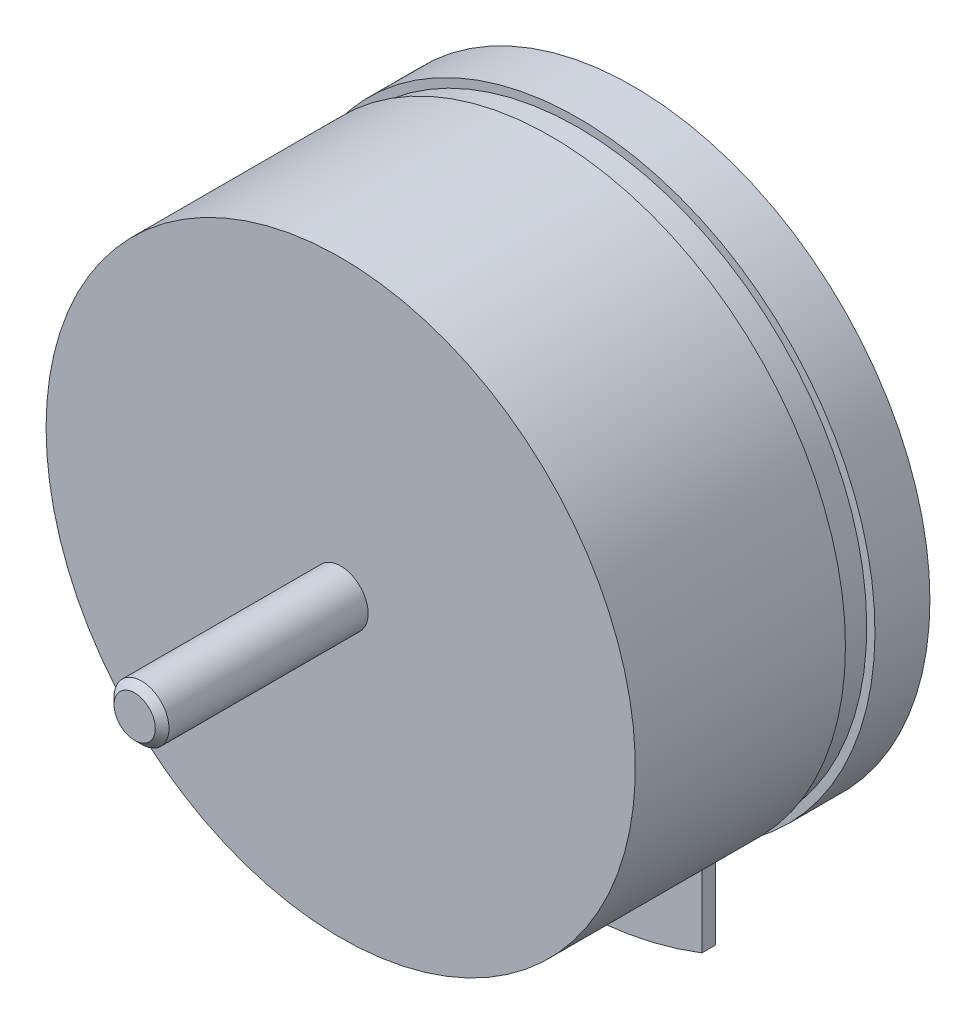
ISO-10303-21;
HEADER;
FILE_DESCRIPTION(('STEP AP214'),'2;1');
FILE_NAME('part.step','',(''),(''),'','','');
FILE_SCHEMA(('AUTOMOTIVE_DESIGN { 1 0 10303 214 1 1 1 1 }'));
ENDSEC;
DATA;
#1=APPLICATION_CONTEXT('core data for automotive mechanical design processes');
#2=APPLICATION_PROTOCOL_DEFINITION('international standard','automotive_design',2000,#1);
#3=PRODUCT_CONTEXT('',#1,'mechanical');
#4=PRODUCT('Part','Part','',(#3));
#5=PRODUCT_RELATED_PRODUCT_CATEGORY('part','',(#4));
#6=PRODUCT_DEFINITION_FORMATION('','',#4);
#7=PRODUCT_DEFINITION_CONTEXT('part definition',#1,'design');
#8=PRODUCT_DEFINITION('design','',#6,#7);
#9=PRODUCT_DEFINITION_SHAPE('','',#8);
#10=(LENGTH_UNIT() NAMED_UNIT(*) SI_UNIT(.MILLI.,.METRE.));
#11=(NAMED_UNIT(*) PLANE_ANGLE_UNIT() SI_UNIT($,.RADIAN.));
#12=(NAMED_UNIT(*) SI_UNIT($,.STERADIAN.) SOLID_ANGLE_UNIT());
#13=UNCERTAINTY_MEASURE_WITH_UNIT(LENGTH_MEASURE(1.E-05),#10,'distance_accuracy_value','');
#14=(GEOMETRIC_REPRESENTATION_CONTEXT(3) GLOBAL_UNCERTAINTY_ASSIGNED_CONTEXT((#13)) GLOBAL_UNIT_ASSIGNED_CONTEXT((#10,
#11,#12)) REPRESENTATION_CONTEXT('',''));
#15=CARTESIAN_POINT('',(0.,0.,0.));
#16=DIRECTION('',(0.,0.,1.));
#17=DIRECTION('',(1.,0.,0.));
#18=AXIS2_PLACEMENT_3D('',#15,#16,#17);
#19=CARTESIAN_POINT('',(0.,0.,4.));
#20=DIRECTION('',(0.,0.,1.));
#21=DIRECTION('',(1.,0.,0.));
#22=AXIS2_PLACEMENT_3D('',#19,#20,#21);
#23=PLANE('',#22);
#24=CARTESIAN_POINT('',(0.,0.,4.));
#25=DIRECTION('',(0.,0.,1.));
#26=DIRECTION('',(1.,0.,0.));
#27=AXIS2_PLACEMENT_3D('',#24,#25,#26);
#28=CIRCLE('',#27,21.6);
#29=CARTESIAN_POINT('',(10.,-19.1457567100389,4.));
#30=VERTEX_POINT('',#29);
#31=CARTESIAN_POINT('',(-10.,-19.1457567100389,4.));
#32=VERTEX_POINT('',#31);
#33=EDGE_CURVE('E151',#30,#32,#28,.T.);
#34=ORIENTED_EDGE('',*,*,#33,.T.);
#35=DIRECTION('',(0.,-1.,0.));
#36=VECTOR('',#35,1.);
#37=CARTESIAN_POINT('',(-10.,-18.4661853126194,4.));
#38=LINE('',#37,#36);
#39=CARTESIAN_POINT('',(-10.,-18.4661853126194,4.));
#40=VERTEX_POINT('',#39);
#41=EDGE_CURVE('E293',#40,#32,#38,.T.);
#42=ORIENTED_EDGE('',*,*,#41,.F.);
#43=CARTESIAN_POINT('',(0.,0.,4.));
#44=DIRECTION('',(0.,0.,1.));
#45=DIRECTION('',(1.,0.,0.));
#46=AXIS2_PLACEMENT_3D('',#43,#44,#45);
#47=CIRCLE('',#46,21.);
#48=CARTESIAN_POINT('',(10.,-18.4661853126194,4.));
#49=VERTEX_POINT('',#48);
#50=EDGE_CURVE('E108',#49,#40,#47,.T.);
#51=ORIENTED_EDGE('',*,*,#50,.F.);
#52=DIRECTION('',(0.,1.,0.));
#53=VECTOR('',#52,1.);
#54=CARTESIAN_POINT('',(10.,-18.4661853126194,4.));
#55=LINE('',#54,#53);
#56=EDGE_CURVE('E290',#30,#49,#55,.T.);
#57=ORIENTED_EDGE('',*,*,#56,.F.);
#58=EDGE_LOOP('',(#34,#42,#51,#57));
#59=FACE_BOUND('',#58,.T.);
#60=ADVANCED_FACE('F36',(#59),#23,.T.);
#61=CARTESIAN_POINT('',(0.,0.,6.));
#62=DIRECTION('',(0.,0.,-1.));
#63=DIRECTION('',(-1.,0.,0.));
#64=AXIS2_PLACEMENT_3D('',#61,#62,#63);
#65=CYLINDRICAL_SURFACE('',#64,21.);
#66=CARTESIAN_POINT('',(0.,0.,6.));
#67=DIRECTION('',(0.,0.,1.));
#68=DIRECTION('',(1.,0.,0.));
#69=AXIS2_PLACEMENT_3D('',#66,#67,#68);
#70=CIRCLE('',#69,21.);
#71=CARTESIAN_POINT('',(21.,0.,6.));
#72=VERTEX_POINT('',#71);
#73=EDGE_CURVE('E111',#72,#72,#70,.T.);
#74=ORIENTED_EDGE('',*,*,#73,.F.);
#75=EDGE_LOOP('',(#74));
#76=FACE_BOUND('',#75,.T.);
#77=DIRECTION('',(0.,0.,-1.));
#78=VECTOR('',#77,1.);
#79=CARTESIAN_POINT('',(-10.,-18.4661853126194,5.));
#80=LINE('',#79,#78);
#81=CARTESIAN_POINT('',(-10.,-18.4661853126194,5.));
#82=VERTEX_POINT('',#81);
#83=EDGE_CURVE('E283',#82,#40,#80,.T.);
#84=ORIENTED_EDGE('',*,*,#83,.F.);
#85=CARTESIAN_POINT('',(0.,0.,5.));
#86=DIRECTION('',(0.,0.,1.));
#87=DIRECTION('',(1.,0.,0.));
#88=AXIS2_PLACEMENT_3D('',#85,#86,#87);
#89=CIRCLE('',#88,21.);
#90=CARTESIAN_POINT('',(10.,-18.4661853126194,5.));
#91=VERTEX_POINT('',#90);
#92=EDGE_CURVE('E99',#82,#91,#89,.T.);
#93=ORIENTED_EDGE('',*,*,#92,.T.);
#94=DIRECTION('',(0.,0.,-1.));
#95=VECTOR('',#94,1.);
#96=CARTESIAN_POINT('',(10.,-18.4661853126194,5.));
#97=LINE('',#96,#95);
#98=EDGE_CURVE('E51',#91,#49,#97,.T.);
#99=ORIENTED_EDGE('',*,*,#98,.T.);
#100=ORIENTED_EDGE('',*,*,#50,.T.);
#101=EDGE_LOOP('',(#84,#93,#99,#100));
#102=FACE_BOUND('',#101,.T.);
#103=ADVANCED_FACE('F180',(#76,#102),#65,.T.);
#104=CARTESIAN_POINT('',(0.,0.,-3.2));
#105=DIRECTION('',(0.,0.,-1.));
#106=DIRECTION('',(-1.,0.,0.));
#107=AXIS2_PLACEMENT_3D('',#104,#105,#106);
#108=PLANE('',#107);
#109=CARTESIAN_POINT('',(0.,0.,-3.2));
#110=DIRECTION('',(0.,0.,-1.));
#111=DIRECTION('',(-1.,0.,0.));
#112=AXIS2_PLACEMENT_3D('',#109,#110,#111);
#113=CIRCLE('',#112,6.);
#114=CARTESIAN_POINT('',(-6.,0.,-3.2));
#115=VERTEX_POINT('',#114);
#116=EDGE_CURVE('E124',#115,#115,#113,.T.);
#117=ORIENTED_EDGE('',*,*,#116,.T.);
#118=EDGE_LOOP('',(#117));
#119=FACE_BOUND('',#118,.T.);
#120=CARTESIAN_POINT('',(0.,0.,-3.2));
#121=DIRECTION('',(0.,0.,-1.));
#122=DIRECTION('',(-1.,0.,0.));
#123=AXIS2_PLACEMENT_3D('',#120,#121,#122);
#124=CIRCLE('',#123,2.);
#125=CARTESIAN_POINT('',(-2.,0.,-3.2));
#126=VERTEX_POINT('',#125);
#127=EDGE_CURVE('E121',#126,#126,#124,.T.);
#128=ORIENTED_EDGE('',*,*,#127,.F.);
#129=EDGE_LOOP('',(#128));
#130=FACE_BOUND('',#129,.T.);
#131=ADVANCED_FACE('F186',(#119,#130),#108,.T.);
#132=CARTESIAN_POINT('',(0.,0.,0.));
#133=DIRECTION('',(0.,0.,1.));
#134=DIRECTION('',(1.,0.,0.));
#135=AXIS2_PLACEMENT_3D('',#132,#133,#134);
#136=PLANE('',#135);
#137=CARTESIAN_POINT('',(0.,0.,0.));
#138=DIRECTION('',(0.,0.,1.));
#139=DIRECTION('',(1.,0.,0.));
#140=AXIS2_PLACEMENT_3D('',#137,#138,#139);
#141=CIRCLE('',#140,21.6);
#142=CARTESIAN_POINT('',(21.6,0.,0.));
#143=VERTEX_POINT('',#142);
#144=EDGE_CURVE('E148',#143,#143,#141,.T.);
#145=ORIENTED_EDGE('',*,*,#144,.F.);
#146=EDGE_LOOP('',(#145));
#147=FACE_BOUND('',#146,.T.);
#148=CARTESIAN_POINT('',(0.,11.,0.));
#149=DIRECTION('',(0.,0.,-1.));
#150=DIRECTION('',(-1.,0.,0.));
#151=AXIS2_PLACEMENT_3D('',#148,#149,#150);
#152=CIRCLE('',#151,1.25);
#153=CARTESIAN_POINT('',(-1.25,11.,0.));
#154=VERTEX_POINT('',#153);
#155=EDGE_CURVE('E137',#154,#154,#152,.T.);
#156=ORIENTED_EDGE('',*,*,#155,.F.);
#157=EDGE_LOOP('',(#156));
#158=FACE_BOUND('',#157,.T.);
#159=CARTESIAN_POINT('',(9.5262794416288,-5.50000000000004,0.));
#160=DIRECTION('',(0.,0.,-1.));
#161=DIRECTION('',(0.500000000000004,0.866025403784436,0.));
#162=AXIS2_PLACEMENT_3D('',#159,#160,#161);
#163=CIRCLE('',#162,1.25);
#164=CARTESIAN_POINT('',(10.1512794416288,-4.4174682452695,0.));
#165=VERTEX_POINT('',#164);
#166=EDGE_CURVE('E131',#165,#165,#163,.T.);
#167=ORIENTED_EDGE('',*,*,#166,.F.);
#168=EDGE_LOOP('',(#167));
#169=FACE_BOUND('',#168,.T.);
#170=CARTESIAN_POINT('',(-9.52627944162887,-5.49999999999991,0.));
#171=DIRECTION('',(0.,0.,-1.));
#172=DIRECTION('',(0.499999999999992,-0.866025403784443,0.));
#173=AXIS2_PLACEMENT_3D('',#170,#171,#172);
#174=CIRCLE('',#173,1.25);
#175=CARTESIAN_POINT('',(-8.90127944162888,-6.58253175473047,0.));
#176=VERTEX_POINT('',#175);
#177=EDGE_CURVE('E127',#176,#176,#174,.T.);
#178=ORIENTED_EDGE('',*,*,#177,.F.);
#179=EDGE_LOOP('',(#178));
#180=FACE_BOUND('',#179,.T.);
#181=CARTESIAN_POINT('',(0.,0.,0.));
#182=DIRECTION('',(0.,0.,1.));
#183=DIRECTION('',(1.,0.,0.));
#184=AXIS2_PLACEMENT_3D('',#181,#182,#183);
#185=CIRCLE('',#184,6.);
#186=CARTESIAN_POINT('',(6.,0.,0.));
#187=VERTEX_POINT('',#186);
#188=EDGE_CURVE('E156',#187,#187,#185,.F.);
#189=ORIENTED_EDGE('',*,*,#188,.F.);
#190=EDGE_LOOP('',(#189));
#191=FACE_BOUND('',#190,.T.);
#192=ADVANCED_FACE('F194',(#147,#158,#169,#180,#191),#136,.F.);
#193=CARTESIAN_POINT('',(0.,0.,4.));
#194=DIRECTION('',(0.,0.,-1.));
#195=DIRECTION('',(-1.,0.,0.));
#196=AXIS2_PLACEMENT_3D('',#193,#194,#195);
#197=CYLINDRICAL_SURFACE('',#196,21.6);
#198=EDGE_CURVE('E59',#32,#30,#28,.T.);
#199=ORIENTED_EDGE('',*,*,#198,.F.);
#200=ORIENTED_EDGE('',*,*,#33,.F.);
#201=EDGE_LOOP('',(#199,#200));
#202=FACE_BOUND('',#201,.T.);
#203=ORIENTED_EDGE('',*,*,#144,.T.);
#204=EDGE_LOOP('',(#203));
#205=FACE_BOUND('',#204,.T.);
#206=ADVANCED_FACE('F197',(#202,#205),#197,.T.);
#207=CARTESIAN_POINT('',(0.,11.,3.9));
#208=DIRECTION('',(0.,0.,-1.));
#209=DIRECTION('',(-1.,0.,0.));
#210=AXIS2_PLACEMENT_3D('',#207,#208,#209);
#211=CYLINDRICAL_SURFACE('',#210,1.25);
#212=CARTESIAN_POINT('',(0.,11.,3.9));
#213=DIRECTION('',(0.,0.,-1.));
#214=DIRECTION('',(-1.,0.,0.));
#215=AXIS2_PLACEMENT_3D('',#212,#213,#214);
#216=CIRCLE('',#215,1.25);
#217=CARTESIAN_POINT('',(-1.25,11.,3.9));
#218=VERTEX_POINT('',#217);
#219=EDGE_CURVE('E140',#218,#218,#216,.T.);
#220=ORIENTED_EDGE('',*,*,#219,.F.);
#221=EDGE_LOOP('',(#220));
#222=FACE_BOUND('',#221,.T.);
#223=ORIENTED_EDGE('',*,*,#155,.T.);
#224=EDGE_LOOP('',(#223));
#225=FACE_BOUND('',#224,.T.);
#226=ADVANCED_FACE('F200',(#222,#225),#211,.F.);
#227=CARTESIAN_POINT('',(0.,11.,3.9));
#228=DIRECTION('',(0.,0.,-1.));
#229=DIRECTION('',(-1.,0.,0.));
#230=AXIS2_PLACEMENT_3D('',#227,#228,#229);
#231=PLANE('',#230);
#232=ORIENTED_EDGE('',*,*,#219,.T.);
#233=EDGE_LOOP('',(#232));
#234=FACE_BOUND('',#233,.T.);
#235=ADVANCED_FACE('F205',(#234),#231,.T.);
#236=CARTESIAN_POINT('',(9.5262794416288,-5.50000000000004,3.9));
#237=DIRECTION('',(0.,0.,-1.));
#238=DIRECTION('',(-1.,0.,0.));
#239=AXIS2_PLACEMENT_3D('',#236,#237,#238);
#240=CYLINDRICAL_SURFACE('',#239,1.25);
#241=CARTESIAN_POINT('',(9.5262794416288,-5.50000000000004,3.9));
#242=DIRECTION('',(0.,0.,-1.));
#243=DIRECTION('',(0.500000000000004,0.866025403784436,0.));
#244=AXIS2_PLACEMENT_3D('',#241,#242,#243);
#245=CIRCLE('',#244,1.25);
#246=CARTESIAN_POINT('',(10.1512794416288,-4.4174682452695,3.9));
#247=VERTEX_POINT('',#246);
#248=EDGE_CURVE('E134',#247,#247,#245,.T.);
#249=ORIENTED_EDGE('',*,*,#248,.F.);
#250=EDGE_LOOP('',(#249));
#251=FACE_BOUND('',#250,.T.);
#252=ORIENTED_EDGE('',*,*,#166,.T.);
#253=EDGE_LOOP('',(#252));
#254=FACE_BOUND('',#253,.T.);
#255=ADVANCED_FACE('F245',(#251,#254),#240,.F.);
#256=CARTESIAN_POINT('',(9.5262794416288,-5.50000000000004,3.9));
#257=DIRECTION('',(0.,0.,-1.));
#258=DIRECTION('',(0.500000000000004,0.866025403784436,0.));
#259=AXIS2_PLACEMENT_3D('',#256,#257,#258);
#260=PLANE('',#259);
#261=ORIENTED_EDGE('',*,*,#248,.T.);
#262=EDGE_LOOP('',(#261));
#263=FACE_BOUND('',#262,.T.);
#264=ADVANCED_FACE('F241',(#263),#260,.T.);
#265=CARTESIAN_POINT('',(-9.52627944162887,-5.49999999999991,3.9));
#266=DIRECTION('',(0.,0.,-1.));
#267=DIRECTION('',(-1.,0.,0.));
#268=AXIS2_PLACEMENT_3D('',#265,#266,#267);
#269=CYLINDRICAL_SURFACE('',#268,1.25);
#270=CARTESIAN_POINT('',(-9.52627944162887,-5.49999999999991,3.9));
#271=DIRECTION('',(0.,0.,-1.));
#272=DIRECTION('',(0.499999999999992,-0.866025403784443,0.));
#273=AXIS2_PLACEMENT_3D('',#270,#271,#272);
#274=CIRCLE('',#273,1.25);
#275=CARTESIAN_POINT('',(-8.90127944162888,-6.58253175473047,3.9));
#276=VERTEX_POINT('',#275);
#277=EDGE_CURVE('E128',#276,#276,#274,.T.);
#278=ORIENTED_EDGE('',*,*,#277,.F.);
#279=EDGE_LOOP('',(#278));
#280=FACE_BOUND('',#279,.T.);
#281=ORIENTED_EDGE('',*,*,#177,.T.);
#282=EDGE_LOOP('',(#281));
#283=FACE_BOUND('',#282,.T.);
#284=ADVANCED_FACE('F233',(#280,#283),#269,.F.);
#285=CARTESIAN_POINT('',(-9.52627944162887,-5.49999999999991,3.9));
#286=DIRECTION('',(0.,0.,-1.));
#287=DIRECTION('',(0.499999999999992,-0.866025403784443,0.));
#288=AXIS2_PLACEMENT_3D('',#285,#286,#287);
#289=PLANE('',#288);
#290=ORIENTED_EDGE('',*,*,#277,.T.);
#291=EDGE_LOOP('',(#290));
#292=FACE_BOUND('',#291,.T.);
#293=ADVANCED_FACE('F223',(#292),#289,.T.);
#294=CARTESIAN_POINT('',(0.,0.,-3.2));
#295=DIRECTION('',(0.,0.,1.));
#296=DIRECTION('',(1.,0.,0.));
#297=AXIS2_PLACEMENT_3D('',#294,#295,#296);
#298=CYLINDRICAL_SURFACE('',#297,6.);
#299=ORIENTED_EDGE('',*,*,#116,.F.);
#300=EDGE_LOOP('',(#299));
#301=FACE_BOUND('',#300,.T.);
#302=ORIENTED_EDGE('',*,*,#188,.T.);
#303=EDGE_LOOP('',(#302));
#304=FACE_BOUND('',#303,.T.);
#305=ADVANCED_FACE('F220',(#301,#304),#298,.T.);
#306=CARTESIAN_POINT('',(0.,0.,-11.));
#307=DIRECTION('',(0.,0.,1.));
#308=DIRECTION('',(1.,0.,0.));
#309=AXIS2_PLACEMENT_3D('',#306,#307,#308);
#310=CYLINDRICAL_SURFACE('',#309,2.);
#311=CARTESIAN_POINT('',(0.,0.,-10.5));
#312=DIRECTION('',(0.,0.,-1.));
#313=DIRECTION('',(-1.,0.,0.));
#314=AXIS2_PLACEMENT_3D('',#311,#312,#313);
#315=CIRCLE('',#314,2.);
#316=CARTESIAN_POINT('',(-2.,0.,-10.5));
#317=VERTEX_POINT('',#316);
#318=EDGE_CURVE('E163',#317,#317,#315,.F.);
#319=ORIENTED_EDGE('',*,*,#318,.T.);
#320=EDGE_LOOP('',(#319));
#321=FACE_BOUND('',#320,.T.);
#322=ORIENTED_EDGE('',*,*,#127,.T.);
#323=EDGE_LOOP('',(#322));
#324=FACE_BOUND('',#323,.T.);
#325=ADVANCED_FACE('F222',(#321,#324),#310,.T.);
#326=CARTESIAN_POINT('',(0.,0.,-11.));
#327=DIRECTION('',(0.,0.,-1.));
#328=DIRECTION('',(-1.,0.,0.));
#329=AXIS2_PLACEMENT_3D('',#326,#327,#328);
#330=PLANE('',#329);
#331=CARTESIAN_POINT('',(0.,0.,-11.));
#332=DIRECTION('',(0.,0.,-1.));
#333=DIRECTION('',(-1.,0.,0.));
#334=AXIS2_PLACEMENT_3D('',#331,#332,#333);
#335=CIRCLE('',#334,1.5);
#336=CARTESIAN_POINT('',(-1.5,0.,-11.));
#337=VERTEX_POINT('',#336);
#338=EDGE_CURVE('E160',#337,#337,#335,.T.);
#339=ORIENTED_EDGE('',*,*,#338,.T.);
#340=EDGE_LOOP('',(#339));
#341=FACE_BOUND('',#340,.T.);
#342=ADVANCED_FACE('F230',(#341),#330,.T.);
#343=CARTESIAN_POINT('',(0.,0.,6.));
#344=DIRECTION('',(0.,0.,1.));
#345=DIRECTION('',(1.,0.,0.));
#346=AXIS2_PLACEMENT_3D('',#343,#344,#345);
#347=PLANE('',#346);
#348=CARTESIAN_POINT('',(0.,0.,6.));
#349=DIRECTION('',(0.,0.,1.));
#350=DIRECTION('',(1.,0.,0.));
#351=AXIS2_PLACEMENT_3D('',#348,#349,#350);
#352=CIRCLE('',#351,21.45);
#353=CARTESIAN_POINT('',(21.45,0.,6.));
#354=VERTEX_POINT('',#353);
#355=EDGE_CURVE('E117',#354,#354,#352,.T.);
#356=ORIENTED_EDGE('',*,*,#355,.F.);
#357=EDGE_LOOP('',(#356));
#358=FACE_BOUND('',#357,.T.);
#359=ORIENTED_EDGE('',*,*,#73,.T.);
#360=EDGE_LOOP('',(#359));
#361=FACE_BOUND('',#360,.T.);
#362=ADVANCED_FACE('F256',(#358,#361),#347,.F.);
#363=CARTESIAN_POINT('',(0.,0.,36.3));
#364=DIRECTION('',(0.,0.,1.));
#365=DIRECTION('',(1.,0.,0.));
#366=AXIS2_PLACEMENT_3D('',#363,#364,#365);
#367=PLANE('',#366);
#368=CARTESIAN_POINT('',(0.,0.,36.3));
#369=DIRECTION('',(0.,0.,1.));
#370=DIRECTION('',(1.,0.,0.));
#371=AXIS2_PLACEMENT_3D('',#368,#369,#370);
#372=CIRCLE('',#371,1.5);
#373=CARTESIAN_POINT('',(1.5,0.,36.3));
#374=VERTEX_POINT('',#373);
#375=EDGE_CURVE('E44',#374,#374,#372,.T.);
#376=ORIENTED_EDGE('',*,*,#375,.T.);
#377=EDGE_LOOP('',(#376));
#378=FACE_BOUND('',#377,.T.);
#379=ADVANCED_FACE('F168',(#378),#367,.T.);
#380=CARTESIAN_POINT('',(0.,0.,36.3));
#381=DIRECTION('',(0.,0.,-1.));
#382=DIRECTION('',(-1.,0.,0.));
#383=AXIS2_PLACEMENT_3D('',#380,#381,#382);
#384=CYLINDRICAL_SURFACE('',#383,2.);
#385=CARTESIAN_POINT('',(0.,0.,35.8));
#386=DIRECTION('',(0.,0.,1.));
#387=DIRECTION('',(1.,0.,0.));
#388=AXIS2_PLACEMENT_3D('',#385,#386,#387);
#389=CIRCLE('',#388,2.);
#390=CARTESIAN_POINT('',(2.,0.,35.8));
#391=VERTEX_POINT('',#390);
#392=EDGE_CURVE('E11',#391,#391,#389,.F.);
#393=ORIENTED_EDGE('',*,*,#392,.T.);
#394=EDGE_LOOP('',(#393));
#395=FACE_BOUND('',#394,.T.);
#396=CARTESIAN_POINT('',(0.,0.,21.3));
#397=DIRECTION('',(0.,0.,-1.));
#398=DIRECTION('',(-1.,0.,0.));
#399=AXIS2_PLACEMENT_3D('',#396,#397,#398);
#400=CIRCLE('',#399,2.);
#401=CARTESIAN_POINT('',(-2.,0.,21.3));
#402=VERTEX_POINT('',#401);
#403=EDGE_CURVE('E150',#402,#402,#400,.F.);
#404=ORIENTED_EDGE('',*,*,#403,.T.);
#405=EDGE_LOOP('',(#404));
#406=FACE_BOUND('',#405,.T.);
#407=ADVANCED_FACE('F255',(#395,#406),#384,.T.);
#408=CARTESIAN_POINT('',(0.,0.,21.3));
#409=DIRECTION('',(0.,0.,-1.));
#410=DIRECTION('',(-1.,0.,0.));
#411=AXIS2_PLACEMENT_3D('',#408,#409,#410);
#412=PLANE('',#411);
#413=CARTESIAN_POINT('',(0.,0.,21.3));
#414=DIRECTION('',(0.,0.,-1.));
#415=DIRECTION('',(-1.,0.,0.));
#416=AXIS2_PLACEMENT_3D('',#413,#414,#415);
#417=CIRCLE('',#416,21.45);
#418=CARTESIAN_POINT('',(-21.45,0.,21.3));
#419=VERTEX_POINT('',#418);
#420=EDGE_CURVE('E143',#419,#419,#417,.T.);
#421=ORIENTED_EDGE('',*,*,#420,.F.);
#422=EDGE_LOOP('',(#421));
#423=FACE_BOUND('',#422,.T.);
#424=ORIENTED_EDGE('',*,*,#403,.F.);
#425=EDGE_LOOP('',(#424));
#426=FACE_BOUND('',#425,.T.);
#427=ADVANCED_FACE('F258',(#423,#426),#412,.F.);
#428=CARTESIAN_POINT('',(0.,0.,21.3));
#429=DIRECTION('',(0.,0.,-1.));
#430=DIRECTION('',(-1.,0.,0.));
#431=AXIS2_PLACEMENT_3D('',#428,#429,#430);
#432=CYLINDRICAL_SURFACE('',#431,21.45);
#433=ORIENTED_EDGE('',*,*,#355,.T.);
#434=EDGE_LOOP('',(#433));
#435=FACE_BOUND('',#434,.T.);
#436=ORIENTED_EDGE('',*,*,#420,.T.);
#437=EDGE_LOOP('',(#436));
#438=FACE_BOUND('',#437,.T.);
#439=ADVANCED_FACE('F192',(#435,#438),#432,.T.);
#440=CARTESIAN_POINT('',(0.,0.,5.));
#441=DIRECTION('',(0.,0.,1.));
#442=DIRECTION('',(1.,0.,0.));
#443=AXIS2_PLACEMENT_3D('',#440,#441,#442);
#444=PLANE('',#443);
#445=ORIENTED_EDGE('',*,*,#92,.F.);
#446=DIRECTION('',(0.,-1.,0.));
#447=VECTOR('',#446,1.);
#448=CARTESIAN_POINT('',(-10.,-18.4661853126194,5.));
#449=LINE('',#448,#447);
#450=CARTESIAN_POINT('',(-10.,-25.5453408124109,5.));
#451=VERTEX_POINT('',#450);
#452=EDGE_CURVE('E94',#82,#451,#449,.T.);
#453=ORIENTED_EDGE('',*,*,#452,.T.);
#454=CARTESIAN_POINT('',(0.,0.,5.));
#455=DIRECTION('',(0.,0.,1.));
#456=DIRECTION('',(1.,0.,0.));
#457=AXIS2_PLACEMENT_3D('',#454,#455,#456);
#458=CIRCLE('',#457,27.4329079250127);
#459=CARTESIAN_POINT('',(10.,-25.5453408124109,5.));
#460=VERTEX_POINT('',#459);
#461=EDGE_CURVE('E85',#451,#460,#458,.T.);
#462=ORIENTED_EDGE('',*,*,#461,.T.);
#463=DIRECTION('',(0.,1.,0.));
#464=VECTOR('',#463,1.);
#465=CARTESIAN_POINT('',(10.,-18.4661853126194,5.));
#466=LINE('',#465,#464);
#467=EDGE_CURVE('E93',#460,#91,#466,.T.);
#468=ORIENTED_EDGE('',*,*,#467,.T.);
#469=EDGE_LOOP('',(#445,#453,#462,#468));
#470=FACE_BOUND('',#469,.T.);
#471=ADVANCED_FACE('F97',(#470),#444,.T.);
#472=CARTESIAN_POINT('',(0.,0.,4.));
#473=DIRECTION('',(0.,0.,1.));
#474=DIRECTION('',(1.,0.,0.));
#475=AXIS2_PLACEMENT_3D('',#472,#473,#474);
#476=PLANE('',#475);
#477=CARTESIAN_POINT('',(-10.,-25.5453408124109,4.));
#478=VERTEX_POINT('',#477);
#479=EDGE_CURVE('E106',#32,#478,#38,.T.);
#480=ORIENTED_EDGE('',*,*,#479,.F.);
#481=ORIENTED_EDGE('',*,*,#198,.T.);
#482=CARTESIAN_POINT('',(10.,-25.5453408124109,4.));
#483=VERTEX_POINT('',#482);
#484=EDGE_CURVE('E102',#483,#30,#55,.T.);
#485=ORIENTED_EDGE('',*,*,#484,.F.);
#486=CARTESIAN_POINT('',(0.,0.,4.));
#487=DIRECTION('',(0.,0.,1.));
#488=DIRECTION('',(1.,0.,0.));
#489=AXIS2_PLACEMENT_3D('',#486,#487,#488);
#490=CIRCLE('',#489,27.4329079250127);
#491=EDGE_CURVE('E291',#478,#483,#490,.T.);
#492=ORIENTED_EDGE('',*,*,#491,.F.);
#493=EDGE_LOOP('',(#480,#481,#485,#492));
#494=FACE_BOUND('',#493,.T.);
#495=ADVANCED_FACE('F274',(#494),#476,.F.);
#496=CARTESIAN_POINT('',(-10.,-18.4661853126194,5.));
#497=DIRECTION('',(1.,0.,0.));
#498=DIRECTION('',(0.,0.,-1.));
#499=AXIS2_PLACEMENT_3D('',#496,#497,#498);
#500=PLANE('',#499);
#501=ORIENTED_EDGE('',*,*,#41,.T.);
#502=ORIENTED_EDGE('',*,*,#479,.T.);
#503=DIRECTION('',(0.,0.,-1.));
#504=VECTOR('',#503,1.);
#505=CARTESIAN_POINT('',(-10.,-25.5453408124109,5.));
#506=LINE('',#505,#504);
#507=EDGE_CURVE('E89',#451,#478,#506,.T.);
#508=ORIENTED_EDGE('',*,*,#507,.F.);
#509=ORIENTED_EDGE('',*,*,#452,.F.);
#510=ORIENTED_EDGE('',*,*,#83,.T.);
#511=EDGE_LOOP('',(#501,#502,#508,#509,#510));
#512=FACE_BOUND('',#511,.T.);
#513=ADVANCED_FACE('F105',(#512),#500,.F.);
#514=CARTESIAN_POINT('',(0.,0.,5.));
#515=DIRECTION('',(0.,0.,-1.));
#516=DIRECTION('',(-1.,0.,0.));
#517=AXIS2_PLACEMENT_3D('',#514,#515,#516);
#518=CYLINDRICAL_SURFACE('',#517,27.4329079250127);
#519=ORIENTED_EDGE('',*,*,#491,.T.);
#520=DIRECTION('',(0.,0.,-1.));
#521=VECTOR('',#520,1.);
#522=CARTESIAN_POINT('',(10.,-25.5453408124109,5.));
#523=LINE('',#522,#521);
#524=EDGE_CURVE('E91',#460,#483,#523,.T.);
#525=ORIENTED_EDGE('',*,*,#524,.F.);
#526=ORIENTED_EDGE('',*,*,#461,.F.);
#527=ORIENTED_EDGE('',*,*,#507,.T.);
#528=EDGE_LOOP('',(#519,#525,#526,#527));
#529=FACE_BOUND('',#528,.T.);
#530=ADVANCED_FACE('F87',(#529),#518,.T.);
#531=CARTESIAN_POINT('',(10.,-18.4661853126194,5.));
#532=DIRECTION('',(-1.,0.,0.));
#533=DIRECTION('',(0.,-1.,0.));
#534=AXIS2_PLACEMENT_3D('',#531,#532,#533);
#535=PLANE('',#534);
#536=ORIENTED_EDGE('',*,*,#484,.T.);
#537=ORIENTED_EDGE('',*,*,#56,.T.);
#538=ORIENTED_EDGE('',*,*,#98,.F.);
#539=ORIENTED_EDGE('',*,*,#467,.F.);
#540=ORIENTED_EDGE('',*,*,#524,.T.);
#541=EDGE_LOOP('',(#536,#537,#538,#539,#540));
#542=FACE_BOUND('',#541,.T.);
#543=ADVANCED_FACE('F176',(#542),#535,.F.);
#544=CARTESIAN_POINT('',(0.,0.,-11.));
#545=DIRECTION('',(0.,0.,1.));
#546=DIRECTION('',(1.,0.,0.));
#547=AXIS2_PLACEMENT_3D('',#544,#545,#546);
#548=CONICAL_SURFACE('',#547,1.5,0.785398163397448);
#549=ORIENTED_EDGE('',*,*,#318,.F.);
#550=EDGE_LOOP('',(#549));
#551=FACE_BOUND('',#550,.T.);
#552=ORIENTED_EDGE('',*,*,#338,.F.);
#553=EDGE_LOOP('',(#552));
#554=FACE_BOUND('',#553,.T.);
#555=ADVANCED_FACE('F171',(#551,#554),#548,.T.);
#556=CARTESIAN_POINT('',(0.,0.,36.3));
#557=DIRECTION('',(0.,0.,-1.));
#558=DIRECTION('',(-1.,0.,0.));
#559=AXIS2_PLACEMENT_3D('',#556,#557,#558);
#560=CONICAL_SURFACE('',#559,1.5,0.785398163397447);
#561=ORIENTED_EDGE('',*,*,#392,.F.);
#562=EDGE_LOOP('',(#561));
#563=FACE_BOUND('',#562,.T.);
#564=ORIENTED_EDGE('',*,*,#375,.F.);
#565=EDGE_LOOP('',(#564));
#566=FACE_BOUND('',#565,.T.);
#567=ADVANCED_FACE('F38',(#563,#566),#560,.T.);
#568=CLOSED_SHELL('',(#60,#103,#131,#192,#206,#226,#235,#255,#264,#284,#293,#305,#325,#342,#362,
#379,#407,#427,#439,#471,#495,#513,#530,#543,#555,#567));
#569=MANIFOLD_SOLID_BREP('B2',#568);
#570=ADVANCED_BREP_SHAPE_REPRESENTATION('',(#18,#569),#14);
#571=SHAPE_DEFINITION_REPRESENTATION(#9,#570);
ENDSEC;
END-ISO-10303-21;
